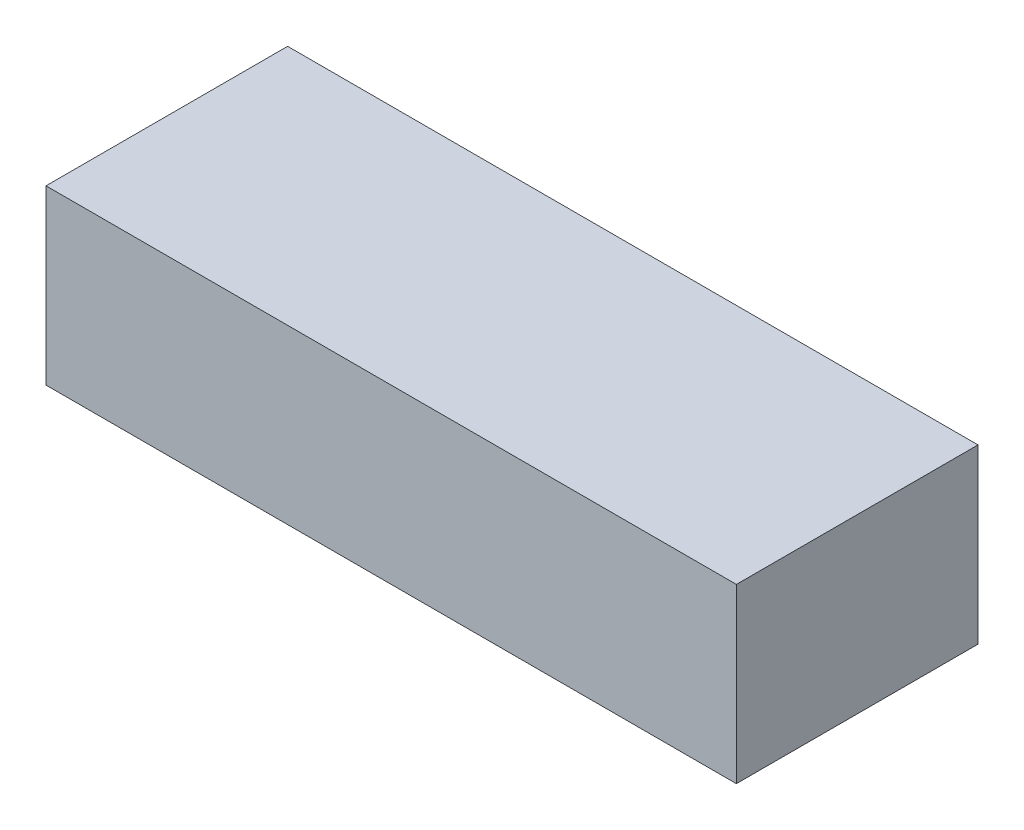
ISO-10303-21;
HEADER;
FILE_DESCRIPTION(('STEP AP214'),'2;1');
FILE_NAME('part.step','',(''),(''),'','','');
FILE_SCHEMA(('AUTOMOTIVE_DESIGN { 1 0 10303 214 1 1 1 1 }'));
ENDSEC;
DATA;
#1=APPLICATION_CONTEXT('core data for automotive mechanical design processes');
#2=APPLICATION_PROTOCOL_DEFINITION('international standard','automotive_design',2000,#1);
#3=PRODUCT_CONTEXT('',#1,'mechanical');
#4=PRODUCT('Part','Part','',(#3));
#5=PRODUCT_RELATED_PRODUCT_CATEGORY('part','',(#4));
#6=PRODUCT_DEFINITION_FORMATION('','',#4);
#7=PRODUCT_DEFINITION_CONTEXT('part definition',#1,'design');
#8=PRODUCT_DEFINITION('design','',#6,#7);
#9=PRODUCT_DEFINITION_SHAPE('','',#8);
#10=(LENGTH_UNIT() NAMED_UNIT(*) SI_UNIT(.MILLI.,.METRE.));
#11=(NAMED_UNIT(*) PLANE_ANGLE_UNIT() SI_UNIT($,.RADIAN.));
#12=(NAMED_UNIT(*) SI_UNIT($,.STERADIAN.) SOLID_ANGLE_UNIT());
#13=UNCERTAINTY_MEASURE_WITH_UNIT(LENGTH_MEASURE(1.E-05),#10,'distance_accuracy_value','');
#14=(GEOMETRIC_REPRESENTATION_CONTEXT(3) GLOBAL_UNCERTAINTY_ASSIGNED_CONTEXT((#13)) GLOBAL_UNIT_ASSIGNED_CONTEXT((#10,
#11,#12)) REPRESENTATION_CONTEXT('',''));
#15=CARTESIAN_POINT('',(0.,0.,0.));
#16=DIRECTION('',(0.,0.,1.));
#17=DIRECTION('',(1.,0.,0.));
#18=AXIS2_PLACEMENT_3D('',#15,#16,#17);
#19=CARTESIAN_POINT('',(50.,25.,-17.5));
#20=DIRECTION('',(-1.,0.,0.));
#21=DIRECTION('',(0.,0.,1.));
#22=AXIS2_PLACEMENT_3D('',#19,#20,#21);
#23=PLANE('',#22);
#24=DIRECTION('',(0.,0.,-1.));
#25=VECTOR('',#24,1.);
#26=CARTESIAN_POINT('',(50.,0.,-17.5));
#27=LINE('',#26,#25);
#28=CARTESIAN_POINT('',(50.,0.,17.5));
#29=VERTEX_POINT('',#28);
#30=CARTESIAN_POINT('',(50.,0.,-17.5));
#31=VERTEX_POINT('',#30);
#32=EDGE_CURVE('E104',#29,#31,#27,.T.);
#33=ORIENTED_EDGE('',*,*,#32,.T.);
#34=DIRECTION('',(0.,-1.,0.));
#35=VECTOR('',#34,1.);
#36=CARTESIAN_POINT('',(50.,25.,-17.5));
#37=LINE('',#36,#35);
#38=CARTESIAN_POINT('',(50.,25.,-17.5));
#39=VERTEX_POINT('',#38);
#40=EDGE_CURVE('E11',#39,#31,#37,.T.);
#41=ORIENTED_EDGE('',*,*,#40,.F.);
#42=DIRECTION('',(0.,0.,-1.));
#43=VECTOR('',#42,1.);
#44=CARTESIAN_POINT('',(50.,25.,-17.5));
#45=LINE('',#44,#43);
#46=CARTESIAN_POINT('',(50.,25.,17.5));
#47=VERTEX_POINT('',#46);
#48=EDGE_CURVE('E92',#47,#39,#45,.T.);
#49=ORIENTED_EDGE('',*,*,#48,.F.);
#50=DIRECTION('',(0.,-1.,0.));
#51=VECTOR('',#50,1.);
#52=CARTESIAN_POINT('',(50.,25.,17.5));
#53=LINE('',#52,#51);
#54=EDGE_CURVE('E100',#47,#29,#53,.T.);
#55=ORIENTED_EDGE('',*,*,#54,.T.);
#56=EDGE_LOOP('',(#33,#41,#49,#55));
#57=FACE_BOUND('',#56,.T.);
#58=ADVANCED_FACE('F41',(#57),#23,.F.);
#59=CARTESIAN_POINT('',(-50.,25.,-17.5));
#60=DIRECTION('',(0.,0.,1.));
#61=DIRECTION('',(1.,0.,0.));
#62=AXIS2_PLACEMENT_3D('',#59,#60,#61);
#63=PLANE('',#62);
#64=DIRECTION('',(-1.,0.,0.));
#65=VECTOR('',#64,1.);
#66=CARTESIAN_POINT('',(-50.,0.,-17.5));
#67=LINE('',#66,#65);
#68=CARTESIAN_POINT('',(-50.,0.,-17.5));
#69=VERTEX_POINT('',#68);
#70=EDGE_CURVE('E96',#31,#69,#67,.T.);
#71=ORIENTED_EDGE('',*,*,#70,.T.);
#72=DIRECTION('',(0.,-1.,0.));
#73=VECTOR('',#72,1.);
#74=CARTESIAN_POINT('',(-50.,25.,-17.5));
#75=LINE('',#74,#73);
#76=CARTESIAN_POINT('',(-50.,25.,-17.5));
#77=VERTEX_POINT('',#76);
#78=EDGE_CURVE('E49',#77,#69,#75,.T.);
#79=ORIENTED_EDGE('',*,*,#78,.F.);
#80=DIRECTION('',(-1.,0.,0.));
#81=VECTOR('',#80,1.);
#82=CARTESIAN_POINT('',(-50.,25.,-17.5));
#83=LINE('',#82,#81);
#84=EDGE_CURVE('E87',#39,#77,#83,.T.);
#85=ORIENTED_EDGE('',*,*,#84,.F.);
#86=ORIENTED_EDGE('',*,*,#40,.T.);
#87=EDGE_LOOP('',(#71,#79,#85,#86));
#88=FACE_BOUND('',#87,.T.);
#89=ADVANCED_FACE('F95',(#88),#63,.F.);
#90=CARTESIAN_POINT('',(-50.,25.,-17.5));
#91=DIRECTION('',(1.,0.,0.));
#92=DIRECTION('',(0.,0.,-1.));
#93=AXIS2_PLACEMENT_3D('',#90,#91,#92);
#94=PLANE('',#93);
#95=DIRECTION('',(0.,0.,1.));
#96=VECTOR('',#95,1.);
#97=CARTESIAN_POINT('',(-50.,0.,-17.5));
#98=LINE('',#97,#96);
#99=CARTESIAN_POINT('',(-50.,0.,17.5));
#100=VERTEX_POINT('',#99);
#101=EDGE_CURVE('E74',#69,#100,#98,.T.);
#102=ORIENTED_EDGE('',*,*,#101,.T.);
#103=DIRECTION('',(0.,-1.,0.));
#104=VECTOR('',#103,1.);
#105=CARTESIAN_POINT('',(-50.,25.,17.5));
#106=LINE('',#105,#104);
#107=CARTESIAN_POINT('',(-50.,25.,17.5));
#108=VERTEX_POINT('',#107);
#109=EDGE_CURVE('E97',#108,#100,#106,.T.);
#110=ORIENTED_EDGE('',*,*,#109,.F.);
#111=DIRECTION('',(0.,0.,1.));
#112=VECTOR('',#111,1.);
#113=CARTESIAN_POINT('',(-50.,25.,-17.5));
#114=LINE('',#113,#112);
#115=EDGE_CURVE('E90',#77,#108,#114,.T.);
#116=ORIENTED_EDGE('',*,*,#115,.F.);
#117=ORIENTED_EDGE('',*,*,#78,.T.);
#118=EDGE_LOOP('',(#102,#110,#116,#117));
#119=FACE_BOUND('',#118,.T.);
#120=ADVANCED_FACE('F98',(#119),#94,.F.);
#121=CARTESIAN_POINT('',(-50.,25.,17.5));
#122=DIRECTION('',(0.,0.,-1.));
#123=DIRECTION('',(-1.,0.,0.));
#124=AXIS2_PLACEMENT_3D('',#121,#122,#123);
#125=PLANE('',#124);
#126=DIRECTION('',(1.,0.,0.));
#127=VECTOR('',#126,1.);
#128=CARTESIAN_POINT('',(-50.,0.,17.5));
#129=LINE('',#128,#127);
#130=EDGE_CURVE('E80',#100,#29,#129,.T.);
#131=ORIENTED_EDGE('',*,*,#130,.T.);
#132=ORIENTED_EDGE('',*,*,#54,.F.);
#133=DIRECTION('',(1.,0.,0.));
#134=VECTOR('',#133,1.);
#135=CARTESIAN_POINT('',(-50.,25.,17.5));
#136=LINE('',#135,#134);
#137=EDGE_CURVE('E57',#108,#47,#136,.T.);
#138=ORIENTED_EDGE('',*,*,#137,.F.);
#139=ORIENTED_EDGE('',*,*,#109,.T.);
#140=EDGE_LOOP('',(#131,#132,#138,#139));
#141=FACE_BOUND('',#140,.T.);
#142=ADVANCED_FACE('F111',(#141),#125,.F.);
#143=CARTESIAN_POINT('',(0.,25.,0.));
#144=DIRECTION('',(0.,1.,0.));
#145=DIRECTION('',(0.,0.,1.));
#146=AXIS2_PLACEMENT_3D('',#143,#144,#145);
#147=PLANE('',#146);
#148=ORIENTED_EDGE('',*,*,#48,.T.);
#149=ORIENTED_EDGE('',*,*,#84,.T.);
#150=ORIENTED_EDGE('',*,*,#115,.T.);
#151=ORIENTED_EDGE('',*,*,#137,.T.);
#152=EDGE_LOOP('',(#148,#149,#150,#151));
#153=FACE_BOUND('',#152,.T.);
#154=ADVANCED_FACE('F88',(#153),#147,.T.);
#155=CARTESIAN_POINT('',(0.,0.,0.));
#156=DIRECTION('',(0.,1.,0.));
#157=DIRECTION('',(0.,0.,1.));
#158=AXIS2_PLACEMENT_3D('',#155,#156,#157);
#159=PLANE('',#158);
#160=ORIENTED_EDGE('',*,*,#32,.F.);
#161=ORIENTED_EDGE('',*,*,#130,.F.);
#162=ORIENTED_EDGE('',*,*,#101,.F.);
#163=ORIENTED_EDGE('',*,*,#70,.F.);
#164=EDGE_LOOP('',(#160,#161,#162,#163));
#165=FACE_BOUND('',#164,.T.);
#166=ADVANCED_FACE('F114',(#165),#159,.F.);
#167=CLOSED_SHELL('',(#58,#89,#120,#142,#154,#166));
#168=MANIFOLD_SOLID_BREP('B2',#167);
#169=ADVANCED_BREP_SHAPE_REPRESENTATION('',(#18,#168),#14);
#170=SHAPE_DEFINITION_REPRESENTATION(#9,#169);
ENDSEC;
END-ISO-10303-21;
